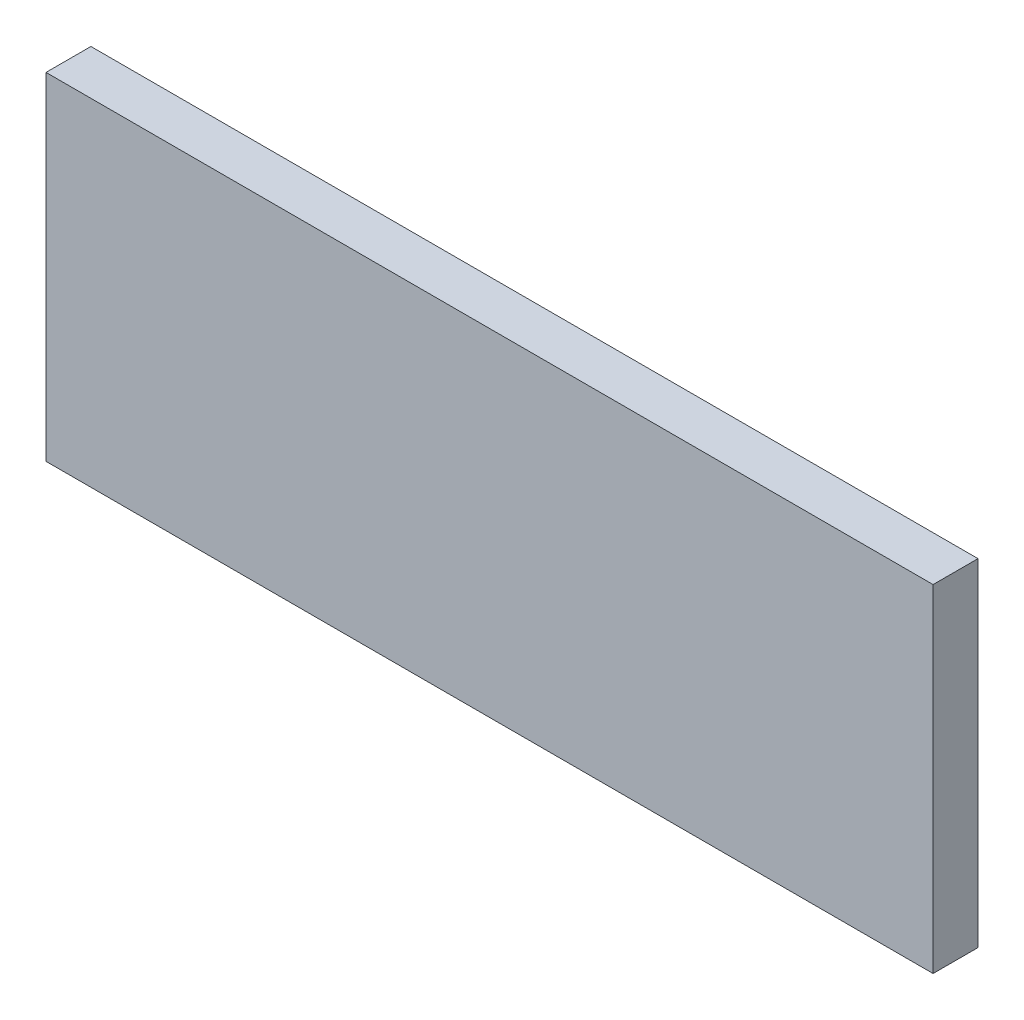
ISO-10303-21;
HEADER;
FILE_DESCRIPTION(('STEP AP214'),'2;1');
FILE_NAME('part.step','',(''),(''),'','','');
FILE_SCHEMA(('AUTOMOTIVE_DESIGN { 1 0 10303 214 1 1 1 1 }'));
ENDSEC;
DATA;
#1=APPLICATION_CONTEXT('core data for automotive mechanical design processes');
#2=APPLICATION_PROTOCOL_DEFINITION('international standard','automotive_design',2000,#1);
#3=PRODUCT_CONTEXT('',#1,'mechanical');
#4=PRODUCT('Part','Part','',(#3));
#5=PRODUCT_RELATED_PRODUCT_CATEGORY('part','',(#4));
#6=PRODUCT_DEFINITION_FORMATION('','',#4);
#7=PRODUCT_DEFINITION_CONTEXT('part definition',#1,'design');
#8=PRODUCT_DEFINITION('design','',#6,#7);
#9=PRODUCT_DEFINITION_SHAPE('','',#8);
#10=(LENGTH_UNIT() NAMED_UNIT(*) SI_UNIT(.MILLI.,.METRE.));
#11=(NAMED_UNIT(*) PLANE_ANGLE_UNIT() SI_UNIT($,.RADIAN.));
#12=(NAMED_UNIT(*) SI_UNIT($,.STERADIAN.) SOLID_ANGLE_UNIT());
#13=UNCERTAINTY_MEASURE_WITH_UNIT(LENGTH_MEASURE(1.E-05),#10,'distance_accuracy_value','');
#14=(GEOMETRIC_REPRESENTATION_CONTEXT(3) GLOBAL_UNCERTAINTY_ASSIGNED_CONTEXT((#13)) GLOBAL_UNIT_ASSIGNED_CONTEXT((#10,
#11,#12)) REPRESENTATION_CONTEXT('',''));
#15=CARTESIAN_POINT('',(0.,0.,0.));
#16=DIRECTION('',(0.,0.,1.));
#17=DIRECTION('',(1.,0.,0.));
#18=AXIS2_PLACEMENT_3D('',#15,#16,#17);
#19=CARTESIAN_POINT('',(39.5,-15.,4.));
#20=DIRECTION('',(-1.,0.,0.));
#21=DIRECTION('',(0.,0.,1.));
#22=AXIS2_PLACEMENT_3D('',#19,#20,#21);
#23=PLANE('',#22);
#24=DIRECTION('',(0.,1.,0.));
#25=VECTOR('',#24,1.);
#26=CARTESIAN_POINT('',(39.5,-15.,0.));
#27=LINE('',#26,#25);
#28=CARTESIAN_POINT('',(39.5,-15.,0.));
#29=VERTEX_POINT('',#28);
#30=CARTESIAN_POINT('',(39.5,15.,0.));
#31=VERTEX_POINT('',#30);
#32=EDGE_CURVE('E107',#29,#31,#27,.T.);
#33=ORIENTED_EDGE('',*,*,#32,.T.);
#34=DIRECTION('',(0.,0.,-1.));
#35=VECTOR('',#34,1.);
#36=CARTESIAN_POINT('',(39.5,15.,4.));
#37=LINE('',#36,#35);
#38=CARTESIAN_POINT('',(39.5,15.,4.));
#39=VERTEX_POINT('',#38);
#40=EDGE_CURVE('E11',#39,#31,#37,.T.);
#41=ORIENTED_EDGE('',*,*,#40,.F.);
#42=DIRECTION('',(0.,1.,0.));
#43=VECTOR('',#42,1.);
#44=CARTESIAN_POINT('',(39.5,-15.,4.));
#45=LINE('',#44,#43);
#46=CARTESIAN_POINT('',(39.5,-15.,4.));
#47=VERTEX_POINT('',#46);
#48=EDGE_CURVE('E91',#47,#39,#45,.T.);
#49=ORIENTED_EDGE('',*,*,#48,.F.);
#50=DIRECTION('',(0.,0.,-1.));
#51=VECTOR('',#50,1.);
#52=CARTESIAN_POINT('',(39.5,-15.,4.));
#53=LINE('',#52,#51);
#54=EDGE_CURVE('E103',#47,#29,#53,.T.);
#55=ORIENTED_EDGE('',*,*,#54,.T.);
#56=EDGE_LOOP('',(#33,#41,#49,#55));
#57=FACE_BOUND('',#56,.T.);
#58=ADVANCED_FACE('F39',(#57),#23,.F.);
#59=CARTESIAN_POINT('',(-39.5,15.,4.));
#60=DIRECTION('',(0.,-1.,0.));
#61=DIRECTION('',(0.,0.,-1.));
#62=AXIS2_PLACEMENT_3D('',#59,#60,#61);
#63=PLANE('',#62);
#64=DIRECTION('',(-1.,0.,0.));
#65=VECTOR('',#64,1.);
#66=CARTESIAN_POINT('',(-39.5,15.,0.));
#67=LINE('',#66,#65);
#68=CARTESIAN_POINT('',(-39.5,15.,0.));
#69=VERTEX_POINT('',#68);
#70=EDGE_CURVE('E96',#31,#69,#67,.T.);
#71=ORIENTED_EDGE('',*,*,#70,.T.);
#72=DIRECTION('',(0.,0.,-1.));
#73=VECTOR('',#72,1.);
#74=CARTESIAN_POINT('',(-39.5,15.,4.));
#75=LINE('',#74,#73);
#76=CARTESIAN_POINT('',(-39.5,15.,4.));
#77=VERTEX_POINT('',#76);
#78=EDGE_CURVE('E48',#77,#69,#75,.T.);
#79=ORIENTED_EDGE('',*,*,#78,.F.);
#80=DIRECTION('',(-1.,0.,0.));
#81=VECTOR('',#80,1.);
#82=CARTESIAN_POINT('',(-39.5,15.,4.));
#83=LINE('',#82,#81);
#84=EDGE_CURVE('E86',#39,#77,#83,.T.);
#85=ORIENTED_EDGE('',*,*,#84,.F.);
#86=ORIENTED_EDGE('',*,*,#40,.T.);
#87=EDGE_LOOP('',(#71,#79,#85,#86));
#88=FACE_BOUND('',#87,.T.);
#89=ADVANCED_FACE('F95',(#88),#63,.F.);
#90=CARTESIAN_POINT('',(-39.5,-15.,4.));
#91=DIRECTION('',(1.,0.,0.));
#92=DIRECTION('',(0.,0.,-1.));
#93=AXIS2_PLACEMENT_3D('',#90,#91,#92);
#94=PLANE('',#93);
#95=DIRECTION('',(0.,-1.,0.));
#96=VECTOR('',#95,1.);
#97=CARTESIAN_POINT('',(-39.5,-15.,0.));
#98=LINE('',#97,#96);
#99=CARTESIAN_POINT('',(-39.5,-15.,0.));
#100=VERTEX_POINT('',#99);
#101=EDGE_CURVE('E73',#69,#100,#98,.T.);
#102=ORIENTED_EDGE('',*,*,#101,.T.);
#103=DIRECTION('',(0.,0.,-1.));
#104=VECTOR('',#103,1.);
#105=CARTESIAN_POINT('',(-39.5,-15.,4.));
#106=LINE('',#105,#104);
#107=CARTESIAN_POINT('',(-39.5,-15.,4.));
#108=VERTEX_POINT('',#107);
#109=EDGE_CURVE('E98',#108,#100,#106,.T.);
#110=ORIENTED_EDGE('',*,*,#109,.F.);
#111=DIRECTION('',(0.,-1.,0.));
#112=VECTOR('',#111,1.);
#113=CARTESIAN_POINT('',(-39.5,-15.,4.));
#114=LINE('',#113,#112);
#115=EDGE_CURVE('E89',#77,#108,#114,.T.);
#116=ORIENTED_EDGE('',*,*,#115,.F.);
#117=ORIENTED_EDGE('',*,*,#78,.T.);
#118=EDGE_LOOP('',(#102,#110,#116,#117));
#119=FACE_BOUND('',#118,.T.);
#120=ADVANCED_FACE('F99',(#119),#94,.F.);
#121=CARTESIAN_POINT('',(-39.5,-15.,4.));
#122=DIRECTION('',(0.,1.,0.));
#123=DIRECTION('',(0.,0.,1.));
#124=AXIS2_PLACEMENT_3D('',#121,#122,#123);
#125=PLANE('',#124);
#126=DIRECTION('',(1.,0.,0.));
#127=VECTOR('',#126,1.);
#128=CARTESIAN_POINT('',(-39.5,-15.,0.));
#129=LINE('',#128,#127);
#130=EDGE_CURVE('E79',#100,#29,#129,.T.);
#131=ORIENTED_EDGE('',*,*,#130,.T.);
#132=ORIENTED_EDGE('',*,*,#54,.F.);
#133=DIRECTION('',(1.,0.,0.));
#134=VECTOR('',#133,1.);
#135=CARTESIAN_POINT('',(-39.5,-15.,4.));
#136=LINE('',#135,#134);
#137=EDGE_CURVE('E56',#108,#47,#136,.T.);
#138=ORIENTED_EDGE('',*,*,#137,.F.);
#139=ORIENTED_EDGE('',*,*,#109,.T.);
#140=EDGE_LOOP('',(#131,#132,#138,#139));
#141=FACE_BOUND('',#140,.T.);
#142=ADVANCED_FACE('F120',(#141),#125,.F.);
#143=CARTESIAN_POINT('',(0.,0.,4.));
#144=DIRECTION('',(0.,0.,-1.));
#145=DIRECTION('',(-1.,0.,0.));
#146=AXIS2_PLACEMENT_3D('',#143,#144,#145);
#147=PLANE('',#146);
#148=ORIENTED_EDGE('',*,*,#48,.T.);
#149=ORIENTED_EDGE('',*,*,#84,.T.);
#150=ORIENTED_EDGE('',*,*,#115,.T.);
#151=ORIENTED_EDGE('',*,*,#137,.T.);
#152=EDGE_LOOP('',(#148,#149,#150,#151));
#153=FACE_BOUND('',#152,.T.);
#154=ADVANCED_FACE('F87',(#153),#147,.F.);
#155=CARTESIAN_POINT('',(0.,0.,0.));
#156=DIRECTION('',(0.,0.,-1.));
#157=DIRECTION('',(-1.,0.,0.));
#158=AXIS2_PLACEMENT_3D('',#155,#156,#157);
#159=PLANE('',#158);
#160=ORIENTED_EDGE('',*,*,#32,.F.);
#161=ORIENTED_EDGE('',*,*,#130,.F.);
#162=ORIENTED_EDGE('',*,*,#101,.F.);
#163=ORIENTED_EDGE('',*,*,#70,.F.);
#164=EDGE_LOOP('',(#160,#161,#162,#163));
#165=FACE_BOUND('',#164,.T.);
#166=ADVANCED_FACE('F123',(#165),#159,.T.);
#167=CLOSED_SHELL('',(#58,#89,#120,#142,#154,#166));
#168=MANIFOLD_SOLID_BREP('B2',#167);
#169=ADVANCED_BREP_SHAPE_REPRESENTATION('',(#18,#168),#14);
#170=SHAPE_DEFINITION_REPRESENTATION(#9,#169);
ENDSEC;
END-ISO-10303-21;
